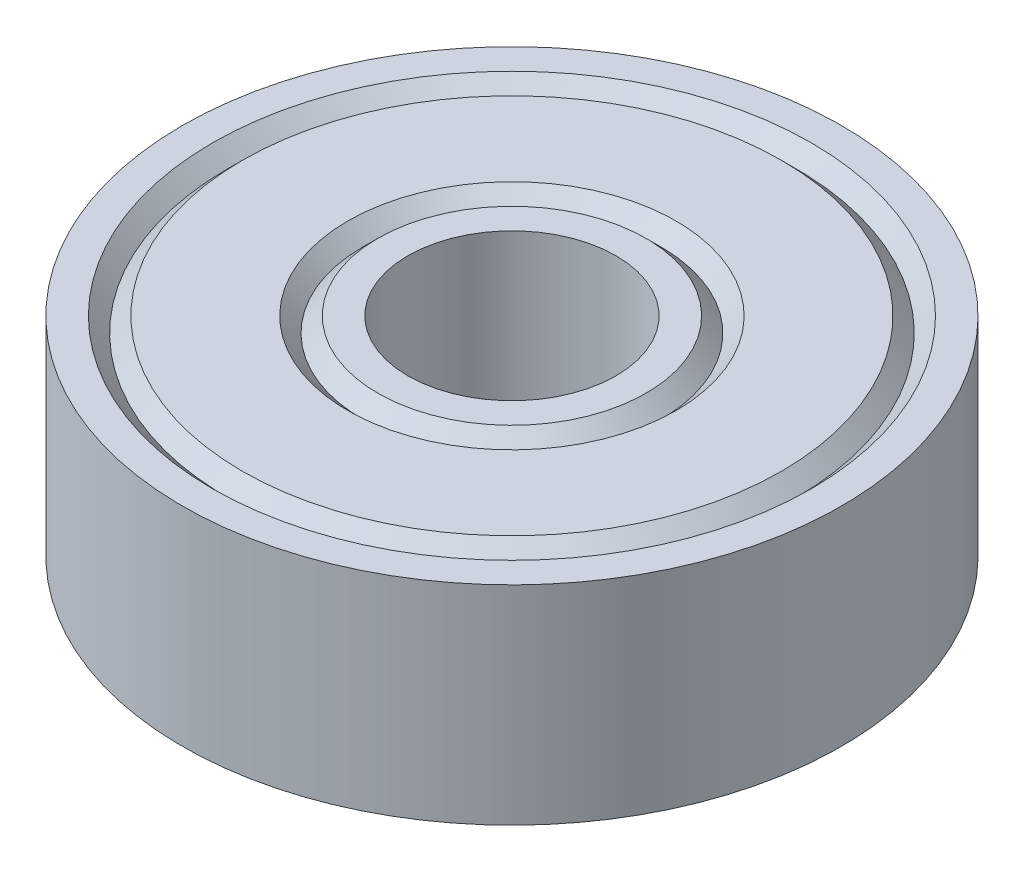
ISO-10303-21;
HEADER;
FILE_DESCRIPTION(('STEP AP214'),'2;1');
FILE_NAME('part.step','',(''),(''),'','','');
FILE_SCHEMA(('AUTOMOTIVE_DESIGN { 1 0 10303 214 1 1 1 1 }'));
ENDSEC;
DATA;
#1=APPLICATION_CONTEXT('core data for automotive mechanical design processes');
#2=APPLICATION_PROTOCOL_DEFINITION('international standard','automotive_design',2000,#1);
#3=PRODUCT_CONTEXT('',#1,'mechanical');
#4=PRODUCT('Part','Part','',(#3));
#5=PRODUCT_RELATED_PRODUCT_CATEGORY('part','',(#4));
#6=PRODUCT_DEFINITION_FORMATION('','',#4);
#7=PRODUCT_DEFINITION_CONTEXT('part definition',#1,'design');
#8=PRODUCT_DEFINITION('design','',#6,#7);
#9=PRODUCT_DEFINITION_SHAPE('','',#8);
#10=(LENGTH_UNIT() NAMED_UNIT(*) SI_UNIT(.MILLI.,.METRE.));
#11=(NAMED_UNIT(*) PLANE_ANGLE_UNIT() SI_UNIT($,.RADIAN.));
#12=(NAMED_UNIT(*) SI_UNIT($,.STERADIAN.) SOLID_ANGLE_UNIT());
#13=UNCERTAINTY_MEASURE_WITH_UNIT(LENGTH_MEASURE(1.E-05),#10,'distance_accuracy_value','');
#14=(GEOMETRIC_REPRESENTATION_CONTEXT(3) GLOBAL_UNCERTAINTY_ASSIGNED_CONTEXT((#13)) GLOBAL_UNIT_ASSIGNED_CONTEXT((#10,
#11,#12)) REPRESENTATION_CONTEXT('',''));
#15=CARTESIAN_POINT('',(0.,0.,0.));
#16=DIRECTION('',(0.,0.,1.));
#17=DIRECTION('',(1.,0.,0.));
#18=AXIS2_PLACEMENT_3D('',#15,#16,#17);
#19=CARTESIAN_POINT('',(0.,3.,0.));
#20=DIRECTION('',(0.,1.,0.));
#21=DIRECTION('',(-1.,0.,0.));
#22=AXIS2_PLACEMENT_3D('',#19,#20,#21);
#23=CYLINDRICAL_SURFACE('',#22,3.);
#24=CARTESIAN_POINT('',(0.,3.00000000000001,0.));
#25=DIRECTION('',(0.,1.,0.));
#26=DIRECTION('',(-1.,0.,0.));
#27=AXIS2_PLACEMENT_3D('',#24,#25,#26);
#28=CIRCLE('',#27,3.);
#29=CARTESIAN_POINT('',(-3.,3.00000000000001,0.));
#30=VERTEX_POINT('',#29);
#31=EDGE_CURVE('E83',#30,#30,#28,.T.);
#32=ORIENTED_EDGE('',*,*,#31,.T.);
#33=EDGE_LOOP('',(#32));
#34=FACE_BOUND('',#33,.T.);
#35=CARTESIAN_POINT('',(0.,-3.00000000000001,0.));
#36=DIRECTION('',(0.,1.,0.));
#37=DIRECTION('',(-1.,0.,0.));
#38=AXIS2_PLACEMENT_3D('',#35,#36,#37);
#39=CIRCLE('',#38,3.);
#40=CARTESIAN_POINT('',(-3.,-3.00000000000001,0.));
#41=VERTEX_POINT('',#40);
#42=EDGE_CURVE('E10',#41,#41,#39,.T.);
#43=ORIENTED_EDGE('',*,*,#42,.F.);
#44=EDGE_LOOP('',(#43));
#45=FACE_BOUND('',#44,.T.);
#46=ADVANCED_FACE('F31',(#34,#45),#23,.F.);
#47=CARTESIAN_POINT('',(-3.,-3.,0.));
#48=DIRECTION('',(0.,-1.,0.));
#49=DIRECTION('',(1.,0.,0.));
#50=AXIS2_PLACEMENT_3D('',#47,#48,#49);
#51=PLANE('',#50);
#52=ORIENTED_EDGE('',*,*,#42,.T.);
#53=EDGE_LOOP('',(#52));
#54=FACE_BOUND('',#53,.T.);
#55=CARTESIAN_POINT('',(0.,-3.,0.));
#56=DIRECTION('',(0.,1.,0.));
#57=DIRECTION('',(-1.,0.,0.));
#58=AXIS2_PLACEMENT_3D('',#55,#56,#57);
#59=CIRCLE('',#58,3.86666666666667);
#60=CARTESIAN_POINT('',(-3.86666666666667,-3.,0.));
#61=VERTEX_POINT('',#60);
#62=EDGE_CURVE('E37',#61,#61,#59,.T.);
#63=ORIENTED_EDGE('',*,*,#62,.F.);
#64=EDGE_LOOP('',(#63));
#65=FACE_BOUND('',#64,.T.);
#66=ADVANCED_FACE('F101',(#54,#65),#51,.T.);
#67=CARTESIAN_POINT('',(0.,-2.56666666666666,0.));
#68=DIRECTION('',(0.,1.,0.));
#69=DIRECTION('',(-1.,0.,0.));
#70=AXIS2_PLACEMENT_3D('',#67,#68,#69);
#71=CONICAL_SURFACE('',#70,4.3,0.785398163397448);
#72=ORIENTED_EDGE('',*,*,#62,.T.);
#73=EDGE_LOOP('',(#72));
#74=FACE_BOUND('',#73,.T.);
#75=CARTESIAN_POINT('',(0.,-2.56666666666666,0.));
#76=DIRECTION('',(0.,1.,0.));
#77=DIRECTION('',(-1.,0.,0.));
#78=AXIS2_PLACEMENT_3D('',#75,#76,#77);
#79=CIRCLE('',#78,4.3);
#80=CARTESIAN_POINT('',(-4.3,-2.56666666666666,0.));
#81=VERTEX_POINT('',#80);
#82=EDGE_CURVE('E41',#81,#81,#79,.T.);
#83=ORIENTED_EDGE('',*,*,#82,.F.);
#84=EDGE_LOOP('',(#83));
#85=FACE_BOUND('',#84,.T.);
#86=ADVANCED_FACE('F105',(#74,#85),#71,.T.);
#87=CARTESIAN_POINT('',(0.,-3.,0.));
#88=DIRECTION('',(0.,-1.,0.));
#89=DIRECTION('',(1.,0.,0.));
#90=AXIS2_PLACEMENT_3D('',#87,#88,#89);
#91=CONICAL_SURFACE('',#90,4.73333333333334,0.785398163397448);
#92=ORIENTED_EDGE('',*,*,#82,.T.);
#93=EDGE_LOOP('',(#92));
#94=FACE_BOUND('',#93,.T.);
#95=CARTESIAN_POINT('',(0.,-3.,0.));
#96=DIRECTION('',(0.,1.,0.));
#97=DIRECTION('',(-1.,0.,0.));
#98=AXIS2_PLACEMENT_3D('',#95,#96,#97);
#99=CIRCLE('',#98,4.73333333333334);
#100=CARTESIAN_POINT('',(-4.73333333333334,-3.,0.));
#101=VERTEX_POINT('',#100);
#102=EDGE_CURVE('E45',#101,#101,#99,.T.);
#103=ORIENTED_EDGE('',*,*,#102,.F.);
#104=EDGE_LOOP('',(#103));
#105=FACE_BOUND('',#104,.T.);
#106=ADVANCED_FACE('F109',(#94,#105),#91,.F.);
#107=CARTESIAN_POINT('',(-4.73333333333334,-3.,0.));
#108=DIRECTION('',(0.,-1.,0.));
#109=DIRECTION('',(1.,0.,0.));
#110=AXIS2_PLACEMENT_3D('',#107,#108,#109);
#111=PLANE('',#110);
#112=ORIENTED_EDGE('',*,*,#102,.T.);
#113=EDGE_LOOP('',(#112));
#114=FACE_BOUND('',#113,.T.);
#115=CARTESIAN_POINT('',(0.,-3.,0.));
#116=DIRECTION('',(0.,1.,0.));
#117=DIRECTION('',(-1.,0.,0.));
#118=AXIS2_PLACEMENT_3D('',#115,#116,#117);
#119=CIRCLE('',#118,7.76666666666666);
#120=CARTESIAN_POINT('',(-7.76666666666666,-3.,0.));
#121=VERTEX_POINT('',#120);
#122=EDGE_CURVE('E50',#121,#121,#119,.T.);
#123=ORIENTED_EDGE('',*,*,#122,.F.);
#124=EDGE_LOOP('',(#123));
#125=FACE_BOUND('',#124,.T.);
#126=ADVANCED_FACE('F115',(#114,#125),#111,.T.);
#127=CARTESIAN_POINT('',(0.,-2.56666666666667,0.));
#128=DIRECTION('',(0.,1.,0.));
#129=DIRECTION('',(-1.,0.,0.));
#130=AXIS2_PLACEMENT_3D('',#127,#128,#129);
#131=CONICAL_SURFACE('',#130,8.2,0.785398163397449);
#132=ORIENTED_EDGE('',*,*,#122,.T.);
#133=EDGE_LOOP('',(#132));
#134=FACE_BOUND('',#133,.T.);
#135=CARTESIAN_POINT('',(0.,-2.56666666666667,0.));
#136=DIRECTION('',(0.,1.,0.));
#137=DIRECTION('',(-1.,0.,0.));
#138=AXIS2_PLACEMENT_3D('',#135,#136,#137);
#139=CIRCLE('',#138,8.2);
#140=CARTESIAN_POINT('',(-8.2,-2.56666666666666,0.));
#141=VERTEX_POINT('',#140);
#142=EDGE_CURVE('E53',#141,#141,#139,.T.);
#143=ORIENTED_EDGE('',*,*,#142,.F.);
#144=EDGE_LOOP('',(#143));
#145=FACE_BOUND('',#144,.T.);
#146=ADVANCED_FACE('F119',(#134,#145),#131,.T.);
#147=CARTESIAN_POINT('',(0.,-3.,0.));
#148=DIRECTION('',(0.,-1.,0.));
#149=DIRECTION('',(1.,0.,0.));
#150=AXIS2_PLACEMENT_3D('',#147,#148,#149);
#151=CONICAL_SURFACE('',#150,8.63333333333333,0.785398163397446);
#152=ORIENTED_EDGE('',*,*,#142,.T.);
#153=EDGE_LOOP('',(#152));
#154=FACE_BOUND('',#153,.T.);
#155=CARTESIAN_POINT('',(0.,-3.,0.));
#156=DIRECTION('',(0.,1.,0.));
#157=DIRECTION('',(-1.,0.,0.));
#158=AXIS2_PLACEMENT_3D('',#155,#156,#157);
#159=CIRCLE('',#158,8.63333333333333);
#160=CARTESIAN_POINT('',(-8.63333333333333,-3.,0.));
#161=VERTEX_POINT('',#160);
#162=EDGE_CURVE('E56',#161,#161,#159,.T.);
#163=ORIENTED_EDGE('',*,*,#162,.F.);
#164=EDGE_LOOP('',(#163));
#165=FACE_BOUND('',#164,.T.);
#166=ADVANCED_FACE('F123',(#154,#165),#151,.F.);
#167=CARTESIAN_POINT('',(-8.63333333333333,-3.,0.));
#168=DIRECTION('',(0.,-1.,0.));
#169=DIRECTION('',(1.,0.,0.));
#170=AXIS2_PLACEMENT_3D('',#167,#168,#169);
#171=PLANE('',#170);
#172=ORIENTED_EDGE('',*,*,#162,.T.);
#173=EDGE_LOOP('',(#172));
#174=FACE_BOUND('',#173,.T.);
#175=CARTESIAN_POINT('',(0.,-3.,0.));
#176=DIRECTION('',(0.,1.,0.));
#177=DIRECTION('',(-1.,0.,0.));
#178=AXIS2_PLACEMENT_3D('',#175,#176,#177);
#179=CIRCLE('',#178,9.5);
#180=CARTESIAN_POINT('',(-9.5,-3.,0.));
#181=VERTEX_POINT('',#180);
#182=EDGE_CURVE('E59',#181,#181,#179,.T.);
#183=ORIENTED_EDGE('',*,*,#182,.F.);
#184=EDGE_LOOP('',(#183));
#185=FACE_BOUND('',#184,.T.);
#186=ADVANCED_FACE('F127',(#174,#185),#171,.T.);
#187=CARTESIAN_POINT('',(0.,3.,0.));
#188=DIRECTION('',(0.,1.,0.));
#189=DIRECTION('',(-1.,0.,0.));
#190=AXIS2_PLACEMENT_3D('',#187,#188,#189);
#191=CYLINDRICAL_SURFACE('',#190,9.5);
#192=ORIENTED_EDGE('',*,*,#182,.T.);
#193=EDGE_LOOP('',(#192));
#194=FACE_BOUND('',#193,.T.);
#195=CARTESIAN_POINT('',(0.,3.,0.));
#196=DIRECTION('',(0.,1.,0.));
#197=DIRECTION('',(-1.,0.,0.));
#198=AXIS2_PLACEMENT_3D('',#195,#196,#197);
#199=CIRCLE('',#198,9.5);
#200=CARTESIAN_POINT('',(-9.5,3.,0.));
#201=VERTEX_POINT('',#200);
#202=EDGE_CURVE('E62',#201,#201,#199,.T.);
#203=ORIENTED_EDGE('',*,*,#202,.F.);
#204=EDGE_LOOP('',(#203));
#205=FACE_BOUND('',#204,.T.);
#206=ADVANCED_FACE('F131',(#194,#205),#191,.T.);
#207=CARTESIAN_POINT('',(-8.63333333333333,3.,0.));
#208=DIRECTION('',(0.,1.,0.));
#209=DIRECTION('',(-1.,0.,0.));
#210=AXIS2_PLACEMENT_3D('',#207,#208,#209);
#211=PLANE('',#210);
#212=ORIENTED_EDGE('',*,*,#202,.T.);
#213=EDGE_LOOP('',(#212));
#214=FACE_BOUND('',#213,.T.);
#215=CARTESIAN_POINT('',(0.,3.,0.));
#216=DIRECTION('',(0.,1.,0.));
#217=DIRECTION('',(-1.,0.,0.));
#218=AXIS2_PLACEMENT_3D('',#215,#216,#217);
#219=CIRCLE('',#218,8.63333333333333);
#220=CARTESIAN_POINT('',(-8.63333333333333,3.,0.));
#221=VERTEX_POINT('',#220);
#222=EDGE_CURVE('E65',#221,#221,#219,.T.);
#223=ORIENTED_EDGE('',*,*,#222,.F.);
#224=EDGE_LOOP('',(#223));
#225=FACE_BOUND('',#224,.T.);
#226=ADVANCED_FACE('F135',(#214,#225),#211,.T.);
#227=CARTESIAN_POINT('',(0.,2.56666666666666,0.));
#228=DIRECTION('',(0.,1.,0.));
#229=DIRECTION('',(-1.,0.,0.));
#230=AXIS2_PLACEMENT_3D('',#227,#228,#229);
#231=CONICAL_SURFACE('',#230,8.2,0.785398163397449);
#232=ORIENTED_EDGE('',*,*,#222,.T.);
#233=EDGE_LOOP('',(#232));
#234=FACE_BOUND('',#233,.T.);
#235=CARTESIAN_POINT('',(0.,2.56666666666666,0.));
#236=DIRECTION('',(0.,1.,0.));
#237=DIRECTION('',(-1.,0.,0.));
#238=AXIS2_PLACEMENT_3D('',#235,#236,#237);
#239=CIRCLE('',#238,8.2);
#240=CARTESIAN_POINT('',(-8.2,2.56666666666666,0.));
#241=VERTEX_POINT('',#240);
#242=EDGE_CURVE('E68',#241,#241,#239,.T.);
#243=ORIENTED_EDGE('',*,*,#242,.F.);
#244=EDGE_LOOP('',(#243));
#245=FACE_BOUND('',#244,.T.);
#246=ADVANCED_FACE('F139',(#234,#245),#231,.F.);
#247=CARTESIAN_POINT('',(0.,3.,0.));
#248=DIRECTION('',(0.,-1.,0.));
#249=DIRECTION('',(1.,0.,0.));
#250=AXIS2_PLACEMENT_3D('',#247,#248,#249);
#251=CONICAL_SURFACE('',#250,7.76666666666667,0.785398163397446);
#252=ORIENTED_EDGE('',*,*,#242,.T.);
#253=EDGE_LOOP('',(#252));
#254=FACE_BOUND('',#253,.T.);
#255=CARTESIAN_POINT('',(0.,3.,0.));
#256=DIRECTION('',(0.,1.,0.));
#257=DIRECTION('',(-1.,0.,0.));
#258=AXIS2_PLACEMENT_3D('',#255,#256,#257);
#259=CIRCLE('',#258,7.76666666666667);
#260=CARTESIAN_POINT('',(-7.76666666666666,3.,0.));
#261=VERTEX_POINT('',#260);
#262=EDGE_CURVE('E71',#261,#261,#259,.T.);
#263=ORIENTED_EDGE('',*,*,#262,.F.);
#264=EDGE_LOOP('',(#263));
#265=FACE_BOUND('',#264,.T.);
#266=ADVANCED_FACE('F143',(#254,#265),#251,.T.);
#267=CARTESIAN_POINT('',(-4.73333333333334,3.,0.));
#268=DIRECTION('',(0.,1.,0.));
#269=DIRECTION('',(-1.,0.,0.));
#270=AXIS2_PLACEMENT_3D('',#267,#268,#269);
#271=PLANE('',#270);
#272=ORIENTED_EDGE('',*,*,#262,.T.);
#273=EDGE_LOOP('',(#272));
#274=FACE_BOUND('',#273,.T.);
#275=CARTESIAN_POINT('',(0.,3.,0.));
#276=DIRECTION('',(0.,1.,0.));
#277=DIRECTION('',(-1.,0.,0.));
#278=AXIS2_PLACEMENT_3D('',#275,#276,#277);
#279=CIRCLE('',#278,4.73333333333334);
#280=CARTESIAN_POINT('',(-4.73333333333334,3.,0.));
#281=VERTEX_POINT('',#280);
#282=EDGE_CURVE('E74',#281,#281,#279,.T.);
#283=ORIENTED_EDGE('',*,*,#282,.F.);
#284=EDGE_LOOP('',(#283));
#285=FACE_BOUND('',#284,.T.);
#286=ADVANCED_FACE('F147',(#274,#285),#271,.T.);
#287=CARTESIAN_POINT('',(0.,2.56666666666666,0.));
#288=DIRECTION('',(0.,1.,0.));
#289=DIRECTION('',(-1.,0.,0.));
#290=AXIS2_PLACEMENT_3D('',#287,#288,#289);
#291=CONICAL_SURFACE('',#290,4.30000000000001,0.785398163397449);
#292=ORIENTED_EDGE('',*,*,#282,.T.);
#293=EDGE_LOOP('',(#292));
#294=FACE_BOUND('',#293,.T.);
#295=CARTESIAN_POINT('',(0.,2.56666666666666,0.));
#296=DIRECTION('',(0.,1.,0.));
#297=DIRECTION('',(-1.,0.,0.));
#298=AXIS2_PLACEMENT_3D('',#295,#296,#297);
#299=CIRCLE('',#298,4.30000000000001);
#300=CARTESIAN_POINT('',(-4.3,2.56666666666667,0.));
#301=VERTEX_POINT('',#300);
#302=EDGE_CURVE('E77',#301,#301,#299,.T.);
#303=ORIENTED_EDGE('',*,*,#302,.F.);
#304=EDGE_LOOP('',(#303));
#305=FACE_BOUND('',#304,.T.);
#306=ADVANCED_FACE('F97',(#294,#305),#291,.F.);
#307=CARTESIAN_POINT('',(0.,3.,0.));
#308=DIRECTION('',(0.,-1.,0.));
#309=DIRECTION('',(1.,0.,0.));
#310=AXIS2_PLACEMENT_3D('',#307,#308,#309);
#311=CONICAL_SURFACE('',#310,3.86666666666667,0.785398163397447);
#312=ORIENTED_EDGE('',*,*,#302,.T.);
#313=EDGE_LOOP('',(#312));
#314=FACE_BOUND('',#313,.T.);
#315=CARTESIAN_POINT('',(0.,3.,0.));
#316=DIRECTION('',(0.,1.,0.));
#317=DIRECTION('',(-1.,0.,0.));
#318=AXIS2_PLACEMENT_3D('',#315,#316,#317);
#319=CIRCLE('',#318,3.86666666666667);
#320=CARTESIAN_POINT('',(-3.86666666666667,3.,0.));
#321=VERTEX_POINT('',#320);
#322=EDGE_CURVE('E80',#321,#321,#319,.T.);
#323=ORIENTED_EDGE('',*,*,#322,.F.);
#324=EDGE_LOOP('',(#323));
#325=FACE_BOUND('',#324,.T.);
#326=ADVANCED_FACE('F91',(#314,#325),#311,.T.);
#327=CARTESIAN_POINT('',(-3.,3.,0.));
#328=DIRECTION('',(0.,1.,0.));
#329=DIRECTION('',(-1.,0.,0.));
#330=AXIS2_PLACEMENT_3D('',#327,#328,#329);
#331=PLANE('',#330);
#332=ORIENTED_EDGE('',*,*,#322,.T.);
#333=EDGE_LOOP('',(#332));
#334=FACE_BOUND('',#333,.T.);
#335=ORIENTED_EDGE('',*,*,#31,.F.);
#336=EDGE_LOOP('',(#335));
#337=FACE_BOUND('',#336,.T.);
#338=ADVANCED_FACE('F89',(#334,#337),#331,.T.);
#339=CLOSED_SHELL('',(#46,#66,#86,#106,#126,#146,#166,#186,#206,#226,#246,#266,#286,#306,#326,#338));
#340=MANIFOLD_SOLID_BREP('B2',#339);
#341=ADVANCED_BREP_SHAPE_REPRESENTATION('',(#18,#340),#14);
#342=SHAPE_DEFINITION_REPRESENTATION(#9,#341);
ENDSEC;
END-ISO-10303-21;
